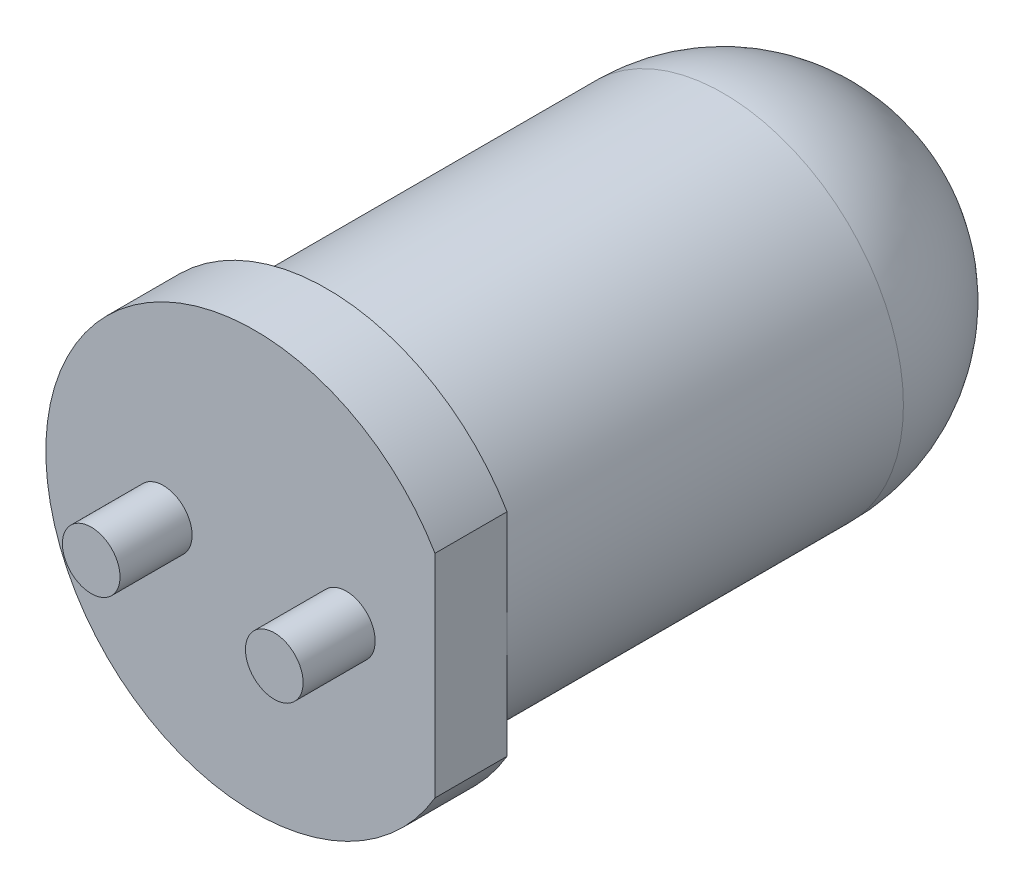
ISO-10303-21;
HEADER;
FILE_DESCRIPTION(('STEP AP214'),'2;1');
FILE_NAME('part.step','',(''),(''),'','','');
FILE_SCHEMA(('AUTOMOTIVE_DESIGN { 1 0 10303 214 1 1 1 1 }'));
ENDSEC;
DATA;
#1=APPLICATION_CONTEXT('core data for automotive mechanical design processes');
#2=APPLICATION_PROTOCOL_DEFINITION('international standard','automotive_design',2000,#1);
#3=PRODUCT_CONTEXT('',#1,'mechanical');
#4=PRODUCT('Part','Part','',(#3));
#5=PRODUCT_RELATED_PRODUCT_CATEGORY('part','',(#4));
#6=PRODUCT_DEFINITION_FORMATION('','',#4);
#7=PRODUCT_DEFINITION_CONTEXT('part definition',#1,'design');
#8=PRODUCT_DEFINITION('design','',#6,#7);
#9=PRODUCT_DEFINITION_SHAPE('','',#8);
#10=(LENGTH_UNIT() NAMED_UNIT(*) SI_UNIT(.MILLI.,.METRE.));
#11=(NAMED_UNIT(*) PLANE_ANGLE_UNIT() SI_UNIT($,.RADIAN.));
#12=(NAMED_UNIT(*) SI_UNIT($,.STERADIAN.) SOLID_ANGLE_UNIT());
#13=UNCERTAINTY_MEASURE_WITH_UNIT(LENGTH_MEASURE(1.E-05),#10,'distance_accuracy_value','');
#14=(GEOMETRIC_REPRESENTATION_CONTEXT(3) GLOBAL_UNCERTAINTY_ASSIGNED_CONTEXT((#13)) GLOBAL_UNIT_ASSIGNED_CONTEXT((#10,
#11,#12)) REPRESENTATION_CONTEXT('',''));
#15=CARTESIAN_POINT('',(0.,0.,0.));
#16=DIRECTION('',(0.,0.,1.));
#17=DIRECTION('',(1.,0.,0.));
#18=AXIS2_PLACEMENT_3D('',#15,#16,#17);
#19=CARTESIAN_POINT('',(2.9,0.,0.));
#20=DIRECTION('',(0.,0.,1.));
#21=DIRECTION('',(1.,0.,0.));
#22=AXIS2_PLACEMENT_3D('',#19,#20,#21);
#23=PLANE('',#22);
#24=CARTESIAN_POINT('',(-1.27,0.,0.));
#25=DIRECTION('',(0.,0.,1.));
#26=DIRECTION('',(-1.,0.,0.));
#27=AXIS2_PLACEMENT_3D('',#24,#25,#26);
#28=CIRCLE('',#27,0.4);
#29=CARTESIAN_POINT('',(-1.67,0.,0.));
#30=VERTEX_POINT('',#29);
#31=EDGE_CURVE('E129',#30,#30,#28,.T.);
#32=ORIENTED_EDGE('',*,*,#31,.F.);
#33=EDGE_LOOP('',(#32));
#34=FACE_BOUND('',#33,.T.);
#35=CARTESIAN_POINT('',(1.27,0.,0.));
#36=DIRECTION('',(0.,0.,1.));
#37=DIRECTION('',(1.,0.,0.));
#38=AXIS2_PLACEMENT_3D('',#35,#36,#37);
#39=CIRCLE('',#38,0.4);
#40=CARTESIAN_POINT('',(1.67,0.,0.));
#41=VERTEX_POINT('',#40);
#42=EDGE_CURVE('E128',#41,#41,#39,.T.);
#43=ORIENTED_EDGE('',*,*,#42,.F.);
#44=EDGE_LOOP('',(#43));
#45=FACE_BOUND('',#44,.T.);
#46=DIRECTION('',(0.,-1.,0.));
#47=VECTOR('',#46,1.);
#48=CARTESIAN_POINT('',(2.5,1.46969384566991,0.));
#49=LINE('',#48,#47);
#50=CARTESIAN_POINT('',(2.5,1.46969384566991,0.));
#51=VERTEX_POINT('',#50);
#52=CARTESIAN_POINT('',(2.5,-1.46969384566991,0.));
#53=VERTEX_POINT('',#52);
#54=EDGE_CURVE('E64',#51,#53,#49,.T.);
#55=ORIENTED_EDGE('',*,*,#54,.F.);
#56=CARTESIAN_POINT('',(0.,0.,0.));
#57=DIRECTION('',(0.,0.,1.));
#58=DIRECTION('',(1.,0.,0.));
#59=AXIS2_PLACEMENT_3D('',#56,#57,#58);
#60=CIRCLE('',#59,2.9);
#61=EDGE_CURVE('E73',#51,#53,#60,.T.);
#62=ORIENTED_EDGE('',*,*,#61,.T.);
#63=EDGE_LOOP('',(#55,#62));
#64=FACE_BOUND('',#63,.T.);
#65=ADVANCED_FACE('F37',(#34,#45,#64),#23,.T.);
#66=CARTESIAN_POINT('',(0.,0.,-6.5));
#67=DIRECTION('',(0.,0.,1.));
#68=DIRECTION('',(1.,0.,0.));
#69=AXIS2_PLACEMENT_3D('',#66,#67,#68);
#70=SPHERICAL_SURFACE('',#69,2.5);
#71=CARTESIAN_POINT('',(0.,0.,-6.5));
#72=DIRECTION('',(0.,0.,1.));
#73=DIRECTION('',(1.,0.,0.));
#74=AXIS2_PLACEMENT_3D('',#71,#72,#73);
#75=CIRCLE('',#74,2.5);
#76=CARTESIAN_POINT('',(2.5,0.,-6.5));
#77=VERTEX_POINT('',#76);
#78=EDGE_CURVE('E70',#77,#77,#75,.T.);
#79=ORIENTED_EDGE('',*,*,#78,.F.);
#80=EDGE_LOOP('',(#79));
#81=FACE_BOUND('',#80,.T.);
#82=ADVANCED_FACE('F91',(#81),#70,.T.);
#83=CARTESIAN_POINT('',(0.,0.,0.));
#84=DIRECTION('',(0.,0.,1.));
#85=DIRECTION('',(1.,0.,0.));
#86=AXIS2_PLACEMENT_3D('',#83,#84,#85);
#87=CYLINDRICAL_SURFACE('',#86,2.5);
#88=ORIENTED_EDGE('',*,*,#78,.T.);
#89=EDGE_LOOP('',(#88));
#90=FACE_BOUND('',#89,.T.);
#91=CARTESIAN_POINT('',(0.,0.,-1.));
#92=DIRECTION('',(0.,0.,1.));
#93=DIRECTION('',(1.,0.,0.));
#94=AXIS2_PLACEMENT_3D('',#91,#92,#93);
#95=CIRCLE('',#94,2.5);
#96=CARTESIAN_POINT('',(2.5,0.,-1.));
#97=VERTEX_POINT('',#96);
#98=EDGE_CURVE('E79',#97,#97,#95,.T.);
#99=ORIENTED_EDGE('',*,*,#98,.F.);
#100=EDGE_LOOP('',(#99));
#101=FACE_BOUND('',#100,.T.);
#102=ADVANCED_FACE('F88',(#90,#101),#87,.T.);
#103=CARTESIAN_POINT('',(2.5,0.,-1.));
#104=DIRECTION('',(0.,0.,-1.));
#105=DIRECTION('',(-1.,0.,0.));
#106=AXIS2_PLACEMENT_3D('',#103,#104,#105);
#107=PLANE('',#106);
#108=DIRECTION('',(0.,1.,0.));
#109=VECTOR('',#108,1.);
#110=CARTESIAN_POINT('',(2.5,0.,-1.));
#111=LINE('',#110,#109);
#112=CARTESIAN_POINT('',(2.5,-1.46969384566991,-0.999999999999999));
#113=VERTEX_POINT('',#112);
#114=EDGE_CURVE('E55',#113,#97,#111,.T.);
#115=ORIENTED_EDGE('',*,*,#114,.F.);
#116=CARTESIAN_POINT('',(0.,0.,-1.));
#117=DIRECTION('',(0.,0.,1.));
#118=DIRECTION('',(1.,0.,0.));
#119=AXIS2_PLACEMENT_3D('',#116,#117,#118);
#120=CIRCLE('',#119,2.9);
#121=CARTESIAN_POINT('',(2.5,1.46969384566991,-1.));
#122=VERTEX_POINT('',#121);
#123=EDGE_CURVE('E77',#122,#113,#120,.T.);
#124=ORIENTED_EDGE('',*,*,#123,.F.);
#125=EDGE_CURVE('E51',#97,#122,#111,.T.);
#126=ORIENTED_EDGE('',*,*,#125,.F.);
#127=ORIENTED_EDGE('',*,*,#98,.T.);
#128=EDGE_LOOP('',(#115,#124,#126,#127));
#129=FACE_BOUND('',#128,.T.);
#130=ADVANCED_FACE('F97',(#129),#107,.T.);
#131=CARTESIAN_POINT('',(0.,0.,0.));
#132=DIRECTION('',(0.,0.,1.));
#133=DIRECTION('',(1.,0.,0.));
#134=AXIS2_PLACEMENT_3D('',#131,#132,#133);
#135=CYLINDRICAL_SURFACE('',#134,2.9);
#136=DIRECTION('',(0.,0.,1.));
#137=VECTOR('',#136,1.);
#138=CARTESIAN_POINT('',(2.5,-1.46969384566991,0.));
#139=LINE('',#138,#137);
#140=EDGE_CURVE('E11',#53,#113,#139,.F.);
#141=ORIENTED_EDGE('',*,*,#140,.F.);
#142=ORIENTED_EDGE('',*,*,#61,.F.);
#143=DIRECTION('',(0.,0.,1.));
#144=VECTOR('',#143,1.);
#145=CARTESIAN_POINT('',(2.5,1.46969384566991,0.));
#146=LINE('',#145,#144);
#147=EDGE_CURVE('E44',#122,#51,#146,.T.);
#148=ORIENTED_EDGE('',*,*,#147,.F.);
#149=ORIENTED_EDGE('',*,*,#123,.T.);
#150=EDGE_LOOP('',(#141,#142,#148,#149));
#151=FACE_BOUND('',#150,.T.);
#152=ADVANCED_FACE('F76',(#151),#135,.T.);
#153=CARTESIAN_POINT('',(2.5,1.46969384566991,-9.));
#154=DIRECTION('',(-1.,0.,0.));
#155=DIRECTION('',(0.,0.,1.));
#156=AXIS2_PLACEMENT_3D('',#153,#154,#155);
#157=PLANE('',#156);
#158=ORIENTED_EDGE('',*,*,#114,.T.);
#159=ORIENTED_EDGE('',*,*,#125,.T.);
#160=ORIENTED_EDGE('',*,*,#147,.T.);
#161=ORIENTED_EDGE('',*,*,#54,.T.);
#162=ORIENTED_EDGE('',*,*,#140,.T.);
#163=EDGE_LOOP('',(#158,#159,#160,#161,#162));
#164=FACE_BOUND('',#163,.T.);
#165=ADVANCED_FACE('F63',(#164),#157,.F.);
#166=CARTESIAN_POINT('',(1.27,0.,1.));
#167=DIRECTION('',(0.,0.,-1.));
#168=DIRECTION('',(-1.,0.,0.));
#169=AXIS2_PLACEMENT_3D('',#166,#167,#168);
#170=CYLINDRICAL_SURFACE('',#169,0.4);
#171=CARTESIAN_POINT('',(1.27,0.,1.));
#172=DIRECTION('',(0.,0.,1.));
#173=DIRECTION('',(1.,0.,0.));
#174=AXIS2_PLACEMENT_3D('',#171,#172,#173);
#175=CIRCLE('',#174,0.4);
#176=CARTESIAN_POINT('',(1.67,0.,1.));
#177=VERTEX_POINT('',#176);
#178=EDGE_CURVE('E74',#177,#177,#175,.T.);
#179=ORIENTED_EDGE('',*,*,#178,.F.);
#180=EDGE_LOOP('',(#179));
#181=FACE_BOUND('',#180,.T.);
#182=ORIENTED_EDGE('',*,*,#42,.T.);
#183=EDGE_LOOP('',(#182));
#184=FACE_BOUND('',#183,.T.);
#185=ADVANCED_FACE('F108',(#181,#184),#170,.T.);
#186=CARTESIAN_POINT('',(1.27,0.,1.));
#187=DIRECTION('',(0.,0.,1.));
#188=DIRECTION('',(1.,0.,0.));
#189=AXIS2_PLACEMENT_3D('',#186,#187,#188);
#190=PLANE('',#189);
#191=ORIENTED_EDGE('',*,*,#178,.T.);
#192=EDGE_LOOP('',(#191));
#193=FACE_BOUND('',#192,.T.);
#194=ADVANCED_FACE('F111',(#193),#190,.T.);
#195=CARTESIAN_POINT('',(-1.27,0.,1.));
#196=DIRECTION('',(0.,0.,-1.));
#197=DIRECTION('',(-1.,0.,0.));
#198=AXIS2_PLACEMENT_3D('',#195,#196,#197);
#199=CYLINDRICAL_SURFACE('',#198,0.4);
#200=CARTESIAN_POINT('',(-1.27,0.,1.));
#201=DIRECTION('',(0.,0.,1.));
#202=DIRECTION('',(-1.,0.,0.));
#203=AXIS2_PLACEMENT_3D('',#200,#201,#202);
#204=CIRCLE('',#203,0.4);
#205=CARTESIAN_POINT('',(-1.67,0.,1.));
#206=VERTEX_POINT('',#205);
#207=EDGE_CURVE('E127',#206,#206,#204,.T.);
#208=ORIENTED_EDGE('',*,*,#207,.F.);
#209=EDGE_LOOP('',(#208));
#210=FACE_BOUND('',#209,.T.);
#211=ORIENTED_EDGE('',*,*,#31,.T.);
#212=EDGE_LOOP('',(#211));
#213=FACE_BOUND('',#212,.T.);
#214=ADVANCED_FACE('F115',(#210,#213),#199,.T.);
#215=CARTESIAN_POINT('',(-1.27,0.,1.));
#216=DIRECTION('',(0.,0.,-1.));
#217=DIRECTION('',(-1.,0.,0.));
#218=AXIS2_PLACEMENT_3D('',#215,#216,#217);
#219=PLANE('',#218);
#220=ORIENTED_EDGE('',*,*,#207,.T.);
#221=EDGE_LOOP('',(#220));
#222=FACE_BOUND('',#221,.T.);
#223=ADVANCED_FACE('F119',(#222),#219,.F.);
#224=CLOSED_SHELL('',(#65,#82,#102,#130,#152,#165,#185,#194,#214,#223));
#225=MANIFOLD_SOLID_BREP('B2',#224);
#226=ADVANCED_BREP_SHAPE_REPRESENTATION('',(#18,#225),#14);
#227=SHAPE_DEFINITION_REPRESENTATION(#9,#226);
ENDSEC;
END-ISO-10303-21;
